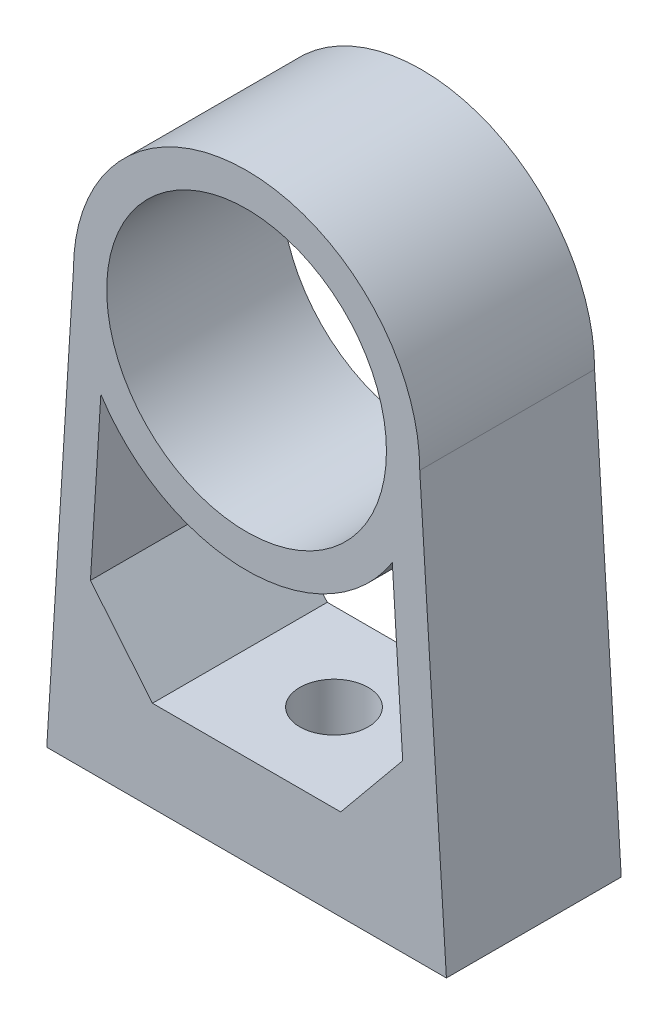
ISO-10303-21;
HEADER;
FILE_DESCRIPTION(('STEP AP214'),'2;1');
FILE_NAME('part.step','',(''),(''),'','','');
FILE_SCHEMA(('AUTOMOTIVE_DESIGN { 1 0 10303 214 1 1 1 1 }'));
ENDSEC;
DATA;
#1=APPLICATION_CONTEXT('core data for automotive mechanical design processes');
#2=APPLICATION_PROTOCOL_DEFINITION('international standard','automotive_design',2000,#1);
#3=PRODUCT_CONTEXT('',#1,'mechanical');
#4=PRODUCT('Part','Part','',(#3));
#5=PRODUCT_RELATED_PRODUCT_CATEGORY('part','',(#4));
#6=PRODUCT_DEFINITION_FORMATION('','',#4);
#7=PRODUCT_DEFINITION_CONTEXT('part definition',#1,'design');
#8=PRODUCT_DEFINITION('design','',#6,#7);
#9=PRODUCT_DEFINITION_SHAPE('','',#8);
#10=(LENGTH_UNIT() NAMED_UNIT(*) SI_UNIT(.MILLI.,.METRE.));
#11=(NAMED_UNIT(*) PLANE_ANGLE_UNIT() SI_UNIT($,.RADIAN.));
#12=(NAMED_UNIT(*) SI_UNIT($,.STERADIAN.) SOLID_ANGLE_UNIT());
#13=UNCERTAINTY_MEASURE_WITH_UNIT(LENGTH_MEASURE(1.E-05),#10,'distance_accuracy_value','');
#14=(GEOMETRIC_REPRESENTATION_CONTEXT(3) GLOBAL_UNCERTAINTY_ASSIGNED_CONTEXT((#13)) GLOBAL_UNIT_ASSIGNED_CONTEXT((#10,
#11,#12)) REPRESENTATION_CONTEXT('',''));
#15=CARTESIAN_POINT('',(0.,0.,0.));
#16=DIRECTION('',(0.,0.,1.));
#17=DIRECTION('',(1.,0.,0.));
#18=AXIS2_PLACEMENT_3D('',#15,#16,#17);
#19=CARTESIAN_POINT('',(0.,0.,16.66875));
#20=DIRECTION('',(0.,0.,1.));
#21=DIRECTION('',(1.,0.,0.));
#22=AXIS2_PLACEMENT_3D('',#19,#20,#21);
#23=PLANE('',#22);
#24=DIRECTION('',(-0.0623782861551808,0.998052578482889,0.));
#25=VECTOR('',#24,1.);
#26=CARTESIAN_POINT('',(16.51,0.,16.66875));
#27=LINE('',#26,#25);
#28=CARTESIAN_POINT('',(19.05,-40.64,16.66875));
#29=VERTEX_POINT('',#28);
#30=CARTESIAN_POINT('',(16.51,0.,16.66875));
#31=VERTEX_POINT('',#30);
#32=EDGE_CURVE('E172',#29,#31,#27,.T.);
#33=ORIENTED_EDGE('',*,*,#32,.T.);
#34=CARTESIAN_POINT('',(0.,0.,16.66875));
#35=DIRECTION('',(0.,0.,1.));
#36=DIRECTION('',(1.,0.,0.));
#37=AXIS2_PLACEMENT_3D('',#34,#35,#36);
#38=CIRCLE('',#37,16.51);
#39=CARTESIAN_POINT('',(-16.51,0.,16.66875));
#40=VERTEX_POINT('',#39);
#41=EDGE_CURVE('E175',#31,#40,#38,.T.);
#42=ORIENTED_EDGE('',*,*,#41,.T.);
#43=DIRECTION('',(-0.0623782861551805,-0.998052578482889,0.));
#44=VECTOR('',#43,1.);
#45=CARTESIAN_POINT('',(-16.51,0.,16.66875));
#46=LINE('',#45,#44);
#47=CARTESIAN_POINT('',(-19.05,-40.64,16.66875));
#48=VERTEX_POINT('',#47);
#49=EDGE_CURVE('E178',#40,#48,#46,.T.);
#50=ORIENTED_EDGE('',*,*,#49,.T.);
#51=DIRECTION('',(1.,0.,0.));
#52=VECTOR('',#51,1.);
#53=CARTESIAN_POINT('',(-19.05,-40.64,16.66875));
#54=LINE('',#53,#52);
#55=EDGE_CURVE('E180',#48,#29,#54,.T.);
#56=ORIENTED_EDGE('',*,*,#55,.T.);
#57=EDGE_LOOP('',(#33,#42,#50,#56));
#58=FACE_BOUND('',#57,.T.);
#59=CARTESIAN_POINT('',(0.,0.,16.66875));
#60=DIRECTION('',(0.,0.,1.));
#61=DIRECTION('',(1.,0.,0.));
#62=AXIS2_PLACEMENT_3D('',#59,#60,#61);
#63=CIRCLE('',#62,13.335);
#64=CARTESIAN_POINT('',(13.335,0.,16.66875));
#65=VERTEX_POINT('',#64);
#66=EDGE_CURVE('E166',#65,#65,#63,.T.);
#67=ORIENTED_EDGE('',*,*,#66,.F.);
#68=EDGE_LOOP('',(#67));
#69=FACE_BOUND('',#68,.T.);
#70=DIRECTION('',(-0.0623782861551805,-0.998052578482889,0.));
#71=VECTOR('',#70,1.);
#72=CARTESIAN_POINT('',(-13.8925387688203,-8.92062030112404,16.66875));
#73=LINE('',#72,#71);
#74=CARTESIAN_POINT('',(-13.8925387688203,-8.92062030112404,16.66875));
#75=VERTEX_POINT('',#74);
#76=CARTESIAN_POINT('',(-14.8837693844101,-24.780310150562,16.66875));
#77=VERTEX_POINT('',#76);
#78=EDGE_CURVE('E121',#75,#77,#73,.T.);
#79=ORIENTED_EDGE('',*,*,#78,.F.);
#80=CARTESIAN_POINT('',(0.,0.,16.66875));
#81=DIRECTION('',(0.,0.,-1.));
#82=DIRECTION('',(1.,0.,0.));
#83=AXIS2_PLACEMENT_3D('',#80,#81,#82);
#84=CIRCLE('',#83,16.51);
#85=CARTESIAN_POINT('',(13.8925387688203,-8.92062030112404,16.66875));
#86=VERTEX_POINT('',#85);
#87=EDGE_CURVE('E113',#86,#75,#84,.T.);
#88=ORIENTED_EDGE('',*,*,#87,.F.);
#89=DIRECTION('',(-0.0623782861551805,0.998052578482889,0.));
#90=VECTOR('',#89,1.);
#91=CARTESIAN_POINT('',(13.8925387688203,-8.92062030112404,16.66875));
#92=LINE('',#91,#90);
#93=CARTESIAN_POINT('',(14.8837693844101,-24.780310150562,16.66875));
#94=VERTEX_POINT('',#93);
#95=EDGE_CURVE('E143',#94,#86,#92,.T.);
#96=ORIENTED_EDGE('',*,*,#95,.F.);
#97=DIRECTION('',(0.635070440373507,0.772454228911849,0.));
#98=VECTOR('',#97,1.);
#99=CARTESIAN_POINT('',(8.97384087997389,-31.968724184025,16.66875));
#100=LINE('',#99,#98);
#101=CARTESIAN_POINT('',(8.97384087997389,-31.968724184025,16.66875));
#102=VERTEX_POINT('',#101);
#103=EDGE_CURVE('E141',#102,#94,#100,.T.);
#104=ORIENTED_EDGE('',*,*,#103,.F.);
#105=DIRECTION('',(1.,0.,0.));
#106=VECTOR('',#105,1.);
#107=CARTESIAN_POINT('',(-8.97384087997388,-31.968724184025,16.66875));
#108=LINE('',#107,#106);
#109=CARTESIAN_POINT('',(-8.97384087997388,-31.968724184025,16.66875));
#110=VERTEX_POINT('',#109);
#111=EDGE_CURVE('E136',#110,#102,#108,.T.);
#112=ORIENTED_EDGE('',*,*,#111,.F.);
#113=DIRECTION('',(0.635070440373508,-0.772454228911849,0.));
#114=VECTOR('',#113,1.);
#115=CARTESIAN_POINT('',(-14.8837693844101,-24.780310150562,16.66875));
#116=LINE('',#115,#114);
#117=EDGE_CURVE('E134',#77,#110,#116,.T.);
#118=ORIENTED_EDGE('',*,*,#117,.F.);
#119=EDGE_LOOP('',(#79,#88,#96,#104,#112,#118));
#120=FACE_BOUND('',#119,.T.);
#121=ADVANCED_FACE('F36',(#58,#69,#120),#23,.T.);
#122=CARTESIAN_POINT('',(0.,0.,0.));
#123=DIRECTION('',(0.,0.,1.));
#124=DIRECTION('',(1.,0.,0.));
#125=AXIS2_PLACEMENT_3D('',#122,#123,#124);
#126=PLANE('',#125);
#127=CARTESIAN_POINT('',(0.,0.,0.));
#128=DIRECTION('',(0.,0.,1.));
#129=DIRECTION('',(1.,0.,0.));
#130=AXIS2_PLACEMENT_3D('',#127,#128,#129);
#131=CIRCLE('',#130,13.335);
#132=CARTESIAN_POINT('',(13.335,0.,0.));
#133=VERTEX_POINT('',#132);
#134=EDGE_CURVE('E129',#133,#133,#131,.T.);
#135=ORIENTED_EDGE('',*,*,#134,.T.);
#136=EDGE_LOOP('',(#135));
#137=FACE_BOUND('',#136,.T.);
#138=DIRECTION('',(-0.0623782861551808,0.998052578482889,0.));
#139=VECTOR('',#138,1.);
#140=CARTESIAN_POINT('',(16.51,0.,0.));
#141=LINE('',#140,#139);
#142=CARTESIAN_POINT('',(19.05,-40.64,0.));
#143=VERTEX_POINT('',#142);
#144=CARTESIAN_POINT('',(16.51,0.,0.));
#145=VERTEX_POINT('',#144);
#146=EDGE_CURVE('E169',#143,#145,#141,.T.);
#147=ORIENTED_EDGE('',*,*,#146,.F.);
#148=DIRECTION('',(1.,0.,0.));
#149=VECTOR('',#148,1.);
#150=CARTESIAN_POINT('',(-19.05,-40.64,0.));
#151=LINE('',#150,#149);
#152=CARTESIAN_POINT('',(-19.05,-40.64,0.));
#153=VERTEX_POINT('',#152);
#154=EDGE_CURVE('E176',#153,#143,#151,.T.);
#155=ORIENTED_EDGE('',*,*,#154,.F.);
#156=DIRECTION('',(-0.0623782861551805,-0.998052578482889,0.));
#157=VECTOR('',#156,1.);
#158=CARTESIAN_POINT('',(-16.51,0.,0.));
#159=LINE('',#158,#157);
#160=CARTESIAN_POINT('',(-16.51,0.,0.));
#161=VERTEX_POINT('',#160);
#162=EDGE_CURVE('E187',#161,#153,#159,.T.);
#163=ORIENTED_EDGE('',*,*,#162,.F.);
#164=CARTESIAN_POINT('',(0.,0.,0.));
#165=DIRECTION('',(0.,0.,1.));
#166=DIRECTION('',(1.,0.,0.));
#167=AXIS2_PLACEMENT_3D('',#164,#165,#166);
#168=CIRCLE('',#167,16.51);
#169=EDGE_CURVE('E185',#145,#161,#168,.T.);
#170=ORIENTED_EDGE('',*,*,#169,.F.);
#171=EDGE_LOOP('',(#147,#155,#163,#170));
#172=FACE_BOUND('',#171,.T.);
#173=CARTESIAN_POINT('',(0.,0.,0.));
#174=DIRECTION('',(0.,0.,-1.));
#175=DIRECTION('',(1.,0.,0.));
#176=AXIS2_PLACEMENT_3D('',#173,#174,#175);
#177=CIRCLE('',#176,16.51);
#178=CARTESIAN_POINT('',(13.8925387688203,-8.92062030112404,0.));
#179=VERTEX_POINT('',#178);
#180=CARTESIAN_POINT('',(-13.8925387688203,-8.92062030112404,0.));
#181=VERTEX_POINT('',#180);
#182=EDGE_CURVE('E59',#179,#181,#177,.T.);
#183=ORIENTED_EDGE('',*,*,#182,.T.);
#184=DIRECTION('',(-0.0623782861551805,-0.998052578482889,0.));
#185=VECTOR('',#184,1.);
#186=CARTESIAN_POINT('',(-13.8925387688203,-8.92062030112404,0.));
#187=LINE('',#186,#185);
#188=CARTESIAN_POINT('',(-14.8837693844101,-24.780310150562,0.));
#189=VERTEX_POINT('',#188);
#190=EDGE_CURVE('E128',#181,#189,#187,.T.);
#191=ORIENTED_EDGE('',*,*,#190,.T.);
#192=DIRECTION('',(0.635070440373508,-0.772454228911849,0.));
#193=VECTOR('',#192,1.);
#194=CARTESIAN_POINT('',(-14.8837693844101,-24.780310150562,0.));
#195=LINE('',#194,#193);
#196=CARTESIAN_POINT('',(-8.97384087997388,-31.968724184025,0.));
#197=VERTEX_POINT('',#196);
#198=EDGE_CURVE('E148',#189,#197,#195,.T.);
#199=ORIENTED_EDGE('',*,*,#198,.T.);
#200=DIRECTION('',(1.,0.,0.));
#201=VECTOR('',#200,1.);
#202=CARTESIAN_POINT('',(-8.97384087997388,-31.968724184025,0.));
#203=LINE('',#202,#201);
#204=CARTESIAN_POINT('',(8.97384087997389,-31.968724184025,0.));
#205=VERTEX_POINT('',#204);
#206=EDGE_CURVE('E151',#197,#205,#203,.T.);
#207=ORIENTED_EDGE('',*,*,#206,.T.);
#208=DIRECTION('',(0.635070440373507,0.772454228911849,0.));
#209=VECTOR('',#208,1.);
#210=CARTESIAN_POINT('',(8.97384087997389,-31.968724184025,0.));
#211=LINE('',#210,#209);
#212=CARTESIAN_POINT('',(14.8837693844101,-24.780310150562,0.));
#213=VERTEX_POINT('',#212);
#214=EDGE_CURVE('E154',#205,#213,#211,.T.);
#215=ORIENTED_EDGE('',*,*,#214,.T.);
#216=DIRECTION('',(-0.0623782861551805,0.998052578482889,0.));
#217=VECTOR('',#216,1.);
#218=CARTESIAN_POINT('',(13.8925387688203,-8.92062030112404,0.));
#219=LINE('',#218,#217);
#220=EDGE_CURVE('E122',#213,#179,#219,.T.);
#221=ORIENTED_EDGE('',*,*,#220,.T.);
#222=EDGE_LOOP('',(#183,#191,#199,#207,#215,#221));
#223=FACE_BOUND('',#222,.T.);
#224=ADVANCED_FACE('F205',(#137,#172,#223),#126,.F.);
#225=CARTESIAN_POINT('',(16.51,0.,16.66875));
#226=DIRECTION('',(-0.998052578482889,-0.0623782861551808,0.));
#227=DIRECTION('',(0.0623782861551808,-0.998052578482889,0.));
#228=AXIS2_PLACEMENT_3D('',#225,#226,#227);
#229=PLANE('',#228);
#230=ORIENTED_EDGE('',*,*,#146,.T.);
#231=DIRECTION('',(0.,0.,-1.));
#232=VECTOR('',#231,1.);
#233=CARTESIAN_POINT('',(16.51,0.,16.66875));
#234=LINE('',#233,#232);
#235=EDGE_CURVE('E11',#31,#145,#234,.T.);
#236=ORIENTED_EDGE('',*,*,#235,.F.);
#237=ORIENTED_EDGE('',*,*,#32,.F.);
#238=DIRECTION('',(0.,0.,-1.));
#239=VECTOR('',#238,1.);
#240=CARTESIAN_POINT('',(19.05,-40.64,16.66875));
#241=LINE('',#240,#239);
#242=EDGE_CURVE('E182',#29,#143,#241,.T.);
#243=ORIENTED_EDGE('',*,*,#242,.T.);
#244=EDGE_LOOP('',(#230,#236,#237,#243));
#245=FACE_BOUND('',#244,.T.);
#246=ADVANCED_FACE('F38',(#245),#229,.F.);
#247=CARTESIAN_POINT('',(0.,0.,16.66875));
#248=DIRECTION('',(0.,0.,-1.));
#249=DIRECTION('',(-1.,0.,0.));
#250=AXIS2_PLACEMENT_3D('',#247,#248,#249);
#251=CYLINDRICAL_SURFACE('',#250,16.51);
#252=ORIENTED_EDGE('',*,*,#169,.T.);
#253=DIRECTION('',(0.,0.,-1.));
#254=VECTOR('',#253,1.);
#255=CARTESIAN_POINT('',(-16.51,0.,16.66875));
#256=LINE('',#255,#254);
#257=EDGE_CURVE('E44',#40,#161,#256,.T.);
#258=ORIENTED_EDGE('',*,*,#257,.F.);
#259=ORIENTED_EDGE('',*,*,#41,.F.);
#260=ORIENTED_EDGE('',*,*,#235,.T.);
#261=EDGE_LOOP('',(#252,#258,#259,#260));
#262=FACE_BOUND('',#261,.T.);
#263=ADVANCED_FACE('F216',(#262),#251,.T.);
#264=CARTESIAN_POINT('',(-16.51,0.,16.66875));
#265=DIRECTION('',(0.998052578482889,-0.0623782861551805,0.));
#266=DIRECTION('',(0.0623782861551805,0.998052578482889,0.));
#267=AXIS2_PLACEMENT_3D('',#264,#265,#266);
#268=PLANE('',#267);
#269=ORIENTED_EDGE('',*,*,#162,.T.);
#270=DIRECTION('',(0.,0.,-1.));
#271=VECTOR('',#270,1.);
#272=CARTESIAN_POINT('',(-19.05,-40.64,16.66875));
#273=LINE('',#272,#271);
#274=EDGE_CURVE('E192',#48,#153,#273,.T.);
#275=ORIENTED_EDGE('',*,*,#274,.F.);
#276=ORIENTED_EDGE('',*,*,#49,.F.);
#277=ORIENTED_EDGE('',*,*,#257,.T.);
#278=EDGE_LOOP('',(#269,#275,#276,#277));
#279=FACE_BOUND('',#278,.T.);
#280=ADVANCED_FACE('F199',(#279),#268,.F.);
#281=CARTESIAN_POINT('',(-19.05,-40.64,16.66875));
#282=DIRECTION('',(0.,1.,0.));
#283=DIRECTION('',(-1.,0.,0.));
#284=AXIS2_PLACEMENT_3D('',#281,#282,#283);
#285=PLANE('',#284);
#286=CARTESIAN_POINT('',(0.,-40.64,8.334375));
#287=DIRECTION('',(0.,-1.,0.));
#288=DIRECTION('',(0.,0.,-1.));
#289=AXIS2_PLACEMENT_3D('',#286,#287,#288);
#290=CIRCLE('',#289,3.26389999999999);
#291=CARTESIAN_POINT('',(0.,-40.64,5.07047500000001));
#292=VERTEX_POINT('',#291);
#293=EDGE_CURVE('E242',#292,#292,#290,.T.);
#294=ORIENTED_EDGE('',*,*,#293,.F.);
#295=EDGE_LOOP('',(#294));
#296=FACE_BOUND('',#295,.T.);
#297=ORIENTED_EDGE('',*,*,#154,.T.);
#298=ORIENTED_EDGE('',*,*,#242,.F.);
#299=ORIENTED_EDGE('',*,*,#55,.F.);
#300=ORIENTED_EDGE('',*,*,#274,.T.);
#301=EDGE_LOOP('',(#297,#298,#299,#300));
#302=FACE_BOUND('',#301,.T.);
#303=ADVANCED_FACE('F209',(#296,#302),#285,.F.);
#304=CARTESIAN_POINT('',(0.,0.,16.66875));
#305=DIRECTION('',(0.,0.,-1.));
#306=DIRECTION('',(-1.,0.,0.));
#307=AXIS2_PLACEMENT_3D('',#304,#305,#306);
#308=CYLINDRICAL_SURFACE('',#307,13.335);
#309=ORIENTED_EDGE('',*,*,#66,.T.);
#310=EDGE_LOOP('',(#309));
#311=FACE_BOUND('',#310,.T.);
#312=ORIENTED_EDGE('',*,*,#134,.F.);
#313=EDGE_LOOP('',(#312));
#314=FACE_BOUND('',#313,.T.);
#315=ADVANCED_FACE('F231',(#311,#314),#308,.F.);
#316=CARTESIAN_POINT('',(0.,0.,16.66875));
#317=DIRECTION('',(0.,0.,-1.));
#318=DIRECTION('',(-1.,0.,0.));
#319=AXIS2_PLACEMENT_3D('',#316,#317,#318);
#320=CYLINDRICAL_SURFACE('',#319,16.51);
#321=ORIENTED_EDGE('',*,*,#182,.F.);
#322=DIRECTION('',(0.,0.,-1.));
#323=VECTOR('',#322,1.);
#324=CARTESIAN_POINT('',(13.8925387688203,-8.92062030112404,16.66875));
#325=LINE('',#324,#323);
#326=EDGE_CURVE('E117',#86,#179,#325,.T.);
#327=ORIENTED_EDGE('',*,*,#326,.F.);
#328=ORIENTED_EDGE('',*,*,#87,.T.);
#329=DIRECTION('',(0.,0.,-1.));
#330=VECTOR('',#329,1.);
#331=CARTESIAN_POINT('',(-13.8925387688203,-8.92062030112404,16.66875));
#332=LINE('',#331,#330);
#333=EDGE_CURVE('E116',#75,#181,#332,.T.);
#334=ORIENTED_EDGE('',*,*,#333,.T.);
#335=EDGE_LOOP('',(#321,#327,#328,#334));
#336=FACE_BOUND('',#335,.T.);
#337=ADVANCED_FACE('F115',(#336),#320,.T.);
#338=CARTESIAN_POINT('',(-13.8925387688203,-8.92062030112404,16.66875));
#339=DIRECTION('',(0.998052578482889,-0.0623782861551805,0.));
#340=DIRECTION('',(0.0623782861551805,0.998052578482889,0.));
#341=AXIS2_PLACEMENT_3D('',#338,#339,#340);
#342=PLANE('',#341);
#343=ORIENTED_EDGE('',*,*,#190,.F.);
#344=ORIENTED_EDGE('',*,*,#333,.F.);
#345=ORIENTED_EDGE('',*,*,#78,.T.);
#346=DIRECTION('',(0.,0.,-1.));
#347=VECTOR('',#346,1.);
#348=CARTESIAN_POINT('',(-14.8837693844101,-24.780310150562,16.66875));
#349=LINE('',#348,#347);
#350=EDGE_CURVE('E130',#77,#189,#349,.T.);
#351=ORIENTED_EDGE('',*,*,#350,.T.);
#352=EDGE_LOOP('',(#343,#344,#345,#351));
#353=FACE_BOUND('',#352,.T.);
#354=ADVANCED_FACE('F125',(#353),#342,.T.);
#355=CARTESIAN_POINT('',(-14.8837693844101,-24.780310150562,16.66875));
#356=DIRECTION('',(0.772454228911849,0.635070440373508,0.));
#357=DIRECTION('',(-0.635070440373508,0.772454228911849,0.));
#358=AXIS2_PLACEMENT_3D('',#355,#356,#357);
#359=PLANE('',#358);
#360=ORIENTED_EDGE('',*,*,#198,.F.);
#361=ORIENTED_EDGE('',*,*,#350,.F.);
#362=ORIENTED_EDGE('',*,*,#117,.T.);
#363=DIRECTION('',(0.,0.,-1.));
#364=VECTOR('',#363,1.);
#365=CARTESIAN_POINT('',(-8.97384087997388,-31.968724184025,16.66875));
#366=LINE('',#365,#364);
#367=EDGE_CURVE('E163',#110,#197,#366,.T.);
#368=ORIENTED_EDGE('',*,*,#367,.T.);
#369=EDGE_LOOP('',(#360,#361,#362,#368));
#370=FACE_BOUND('',#369,.T.);
#371=ADVANCED_FACE('F254',(#370),#359,.T.);
#372=CARTESIAN_POINT('',(-8.97384087997388,-31.968724184025,16.66875));
#373=DIRECTION('',(0.,1.,0.));
#374=DIRECTION('',(0.,0.,1.));
#375=AXIS2_PLACEMENT_3D('',#372,#373,#374);
#376=PLANE('',#375);
#377=CARTESIAN_POINT('',(0.,-31.968724184025,8.334375));
#378=DIRECTION('',(0.,1.,0.));
#379=DIRECTION('',(0.,0.,1.));
#380=AXIS2_PLACEMENT_3D('',#377,#378,#379);
#381=CIRCLE('',#380,3.2639);
#382=CARTESIAN_POINT('',(0.,-31.968724184025,11.598275));
#383=VERTEX_POINT('',#382);
#384=EDGE_CURVE('E146',#383,#383,#381,.T.);
#385=ORIENTED_EDGE('',*,*,#384,.F.);
#386=EDGE_LOOP('',(#385));
#387=FACE_BOUND('',#386,.T.);
#388=ORIENTED_EDGE('',*,*,#206,.F.);
#389=ORIENTED_EDGE('',*,*,#367,.F.);
#390=ORIENTED_EDGE('',*,*,#111,.T.);
#391=DIRECTION('',(0.,0.,-1.));
#392=VECTOR('',#391,1.);
#393=CARTESIAN_POINT('',(8.97384087997389,-31.968724184025,16.66875));
#394=LINE('',#393,#392);
#395=EDGE_CURVE('E161',#102,#205,#394,.T.);
#396=ORIENTED_EDGE('',*,*,#395,.T.);
#397=EDGE_LOOP('',(#388,#389,#390,#396));
#398=FACE_BOUND('',#397,.T.);
#399=ADVANCED_FACE('F250',(#387,#398),#376,.T.);
#400=CARTESIAN_POINT('',(8.97384087997389,-31.968724184025,16.66875));
#401=DIRECTION('',(-0.772454228911849,0.635070440373507,0.));
#402=DIRECTION('',(-0.635070440373507,-0.772454228911849,0.));
#403=AXIS2_PLACEMENT_3D('',#400,#401,#402);
#404=PLANE('',#403);
#405=ORIENTED_EDGE('',*,*,#214,.F.);
#406=ORIENTED_EDGE('',*,*,#395,.F.);
#407=ORIENTED_EDGE('',*,*,#103,.T.);
#408=DIRECTION('',(0.,0.,-1.));
#409=VECTOR('',#408,1.);
#410=CARTESIAN_POINT('',(14.8837693844101,-24.780310150562,16.66875));
#411=LINE('',#410,#409);
#412=EDGE_CURVE('E51',#94,#213,#411,.T.);
#413=ORIENTED_EDGE('',*,*,#412,.T.);
#414=EDGE_LOOP('',(#405,#406,#407,#413));
#415=FACE_BOUND('',#414,.T.);
#416=ADVANCED_FACE('F253',(#415),#404,.T.);
#417=CARTESIAN_POINT('',(13.8925387688203,-8.92062030112404,16.66875));
#418=DIRECTION('',(-0.998052578482889,-0.0623782861551805,0.));
#419=DIRECTION('',(0.0623782861551805,-0.998052578482889,0.));
#420=AXIS2_PLACEMENT_3D('',#417,#418,#419);
#421=PLANE('',#420);
#422=ORIENTED_EDGE('',*,*,#220,.F.);
#423=ORIENTED_EDGE('',*,*,#412,.F.);
#424=ORIENTED_EDGE('',*,*,#95,.T.);
#425=ORIENTED_EDGE('',*,*,#326,.T.);
#426=EDGE_LOOP('',(#422,#423,#424,#425));
#427=FACE_BOUND('',#426,.T.);
#428=ADVANCED_FACE('F299',(#427),#421,.T.);
#429=CARTESIAN_POINT('',(0.,-40.64,8.334375));
#430=DIRECTION('',(0.,-1.,0.));
#431=DIRECTION('',(0.,0.,-1.));
#432=AXIS2_PLACEMENT_3D('',#429,#430,#431);
#433=CYLINDRICAL_SURFACE('',#432,3.2639);
#434=ORIENTED_EDGE('',*,*,#293,.T.);
#435=EDGE_LOOP('',(#434));
#436=FACE_BOUND('',#435,.T.);
#437=ORIENTED_EDGE('',*,*,#384,.T.);
#438=EDGE_LOOP('',(#437));
#439=FACE_BOUND('',#438,.T.);
#440=ADVANCED_FACE('F248',(#436,#439),#433,.F.);
#441=CLOSED_SHELL('',(#121,#224,#246,#263,#280,#303,#315,#337,#354,#371,#399,#416,#428,#440));
#442=MANIFOLD_SOLID_BREP('B2',#441);
#443=ADVANCED_BREP_SHAPE_REPRESENTATION('',(#18,#442),#14);
#444=SHAPE_DEFINITION_REPRESENTATION(#9,#443);
ENDSEC;
END-ISO-10303-21;
